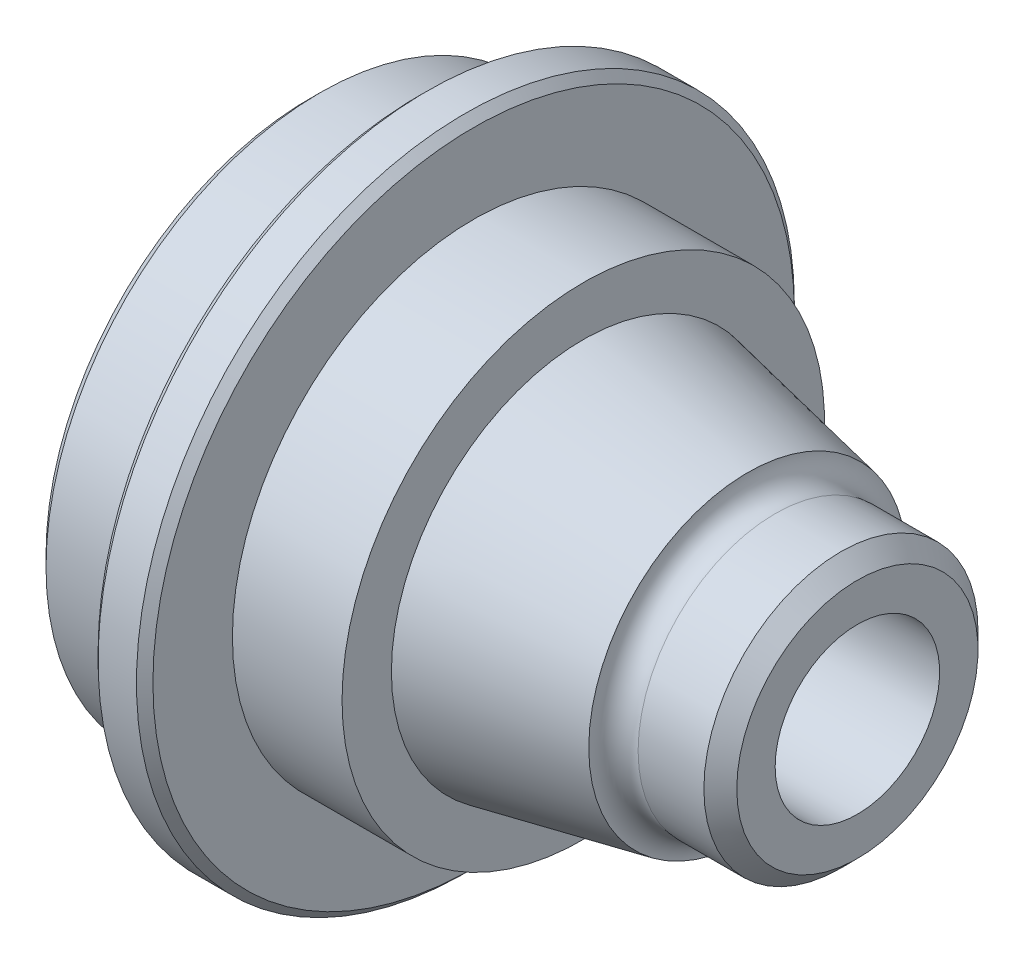
ISO-10303-21;
HEADER;
FILE_DESCRIPTION(('STEP AP214'),'2;1');
FILE_NAME('part.step','',(''),(''),'','','');
FILE_SCHEMA(('AUTOMOTIVE_DESIGN { 1 0 10303 214 1 1 1 1 }'));
ENDSEC;
DATA;
#1=APPLICATION_CONTEXT('core data for automotive mechanical design processes');
#2=APPLICATION_PROTOCOL_DEFINITION('international standard','automotive_design',2000,#1);
#3=PRODUCT_CONTEXT('',#1,'mechanical');
#4=PRODUCT('Part','Part','',(#3));
#5=PRODUCT_RELATED_PRODUCT_CATEGORY('part','',(#4));
#6=PRODUCT_DEFINITION_FORMATION('','',#4);
#7=PRODUCT_DEFINITION_CONTEXT('part definition',#1,'design');
#8=PRODUCT_DEFINITION('design','',#6,#7);
#9=PRODUCT_DEFINITION_SHAPE('','',#8);
#10=(LENGTH_UNIT() NAMED_UNIT(*) SI_UNIT(.MILLI.,.METRE.));
#11=(NAMED_UNIT(*) PLANE_ANGLE_UNIT() SI_UNIT($,.RADIAN.));
#12=(NAMED_UNIT(*) SI_UNIT($,.STERADIAN.) SOLID_ANGLE_UNIT());
#13=UNCERTAINTY_MEASURE_WITH_UNIT(LENGTH_MEASURE(1.E-05),#10,'distance_accuracy_value','');
#14=(GEOMETRIC_REPRESENTATION_CONTEXT(3) GLOBAL_UNCERTAINTY_ASSIGNED_CONTEXT((#13)) GLOBAL_UNIT_ASSIGNED_CONTEXT((#10,
#11,#12)) REPRESENTATION_CONTEXT('',''));
#15=CARTESIAN_POINT('',(0.,0.,0.));
#16=DIRECTION('',(0.,0.,1.));
#17=DIRECTION('',(1.,0.,0.));
#18=AXIS2_PLACEMENT_3D('',#15,#16,#17);
#19=CARTESIAN_POINT('',(-69.26918308439,0.,0.));
#20=DIRECTION('',(-1.,0.,0.));
#21=DIRECTION('',(0.,0.,1.));
#22=AXIS2_PLACEMENT_3D('',#19,#20,#21);
#23=DEGENERATE_TOROIDAL_SURFACE('',#22,25.4998694941201,60.,.F.);
#24=CARTESIAN_POINT('',(-27.2135847593865,0.,0.));
#25=DIRECTION('',(-1.,0.,0.));
#26=DIRECTION('',(0.,0.,1.));
#27=AXIS2_PLACEMENT_3D('',#24,#25,#26);
#28=CIRCLE('',#27,17.2941330006918);
#29=CARTESIAN_POINT('',(-27.2135847593865,0.,17.2941330006918));
#30=VERTEX_POINT('',#29);
#31=EDGE_CURVE('E80',#30,#30,#28,.F.);
#32=ORIENTED_EDGE('',*,*,#31,.T.);
#33=EDGE_LOOP('',(#32));
#34=FACE_BOUND('',#33,.T.);
#35=CARTESIAN_POINT('',(-77.,0.,0.));
#36=DIRECTION('',(-1.,0.,0.));
#37=DIRECTION('',(0.,0.,1.));
#38=AXIS2_PLACEMENT_3D('',#35,#36,#37);
#39=CIRCLE('',#38,34.);
#40=CARTESIAN_POINT('',(-77.,0.,34.));
#41=VERTEX_POINT('',#40);
#42=EDGE_CURVE('E141',#41,#41,#39,.T.);
#43=ORIENTED_EDGE('',*,*,#42,.T.);
#44=EDGE_LOOP('',(#43));
#45=FACE_BOUND('',#44,.T.);
#46=ADVANCED_FACE('F44',(#34,#45),#23,.T.);
#47=CARTESIAN_POINT('',(-117.125626325083,0.,0.));
#48=DIRECTION('',(-1.,0.,0.));
#49=DIRECTION('',(0.,0.,1.));
#50=AXIS2_PLACEMENT_3D('',#47,#48,#49);
#51=CYLINDRICAL_SURFACE('',#50,15.);
#52=CARTESIAN_POINT('',(-21.606171649386,0.,0.));
#53=DIRECTION('',(1.,0.,0.));
#54=DIRECTION('',(0.,0.,-1.));
#55=AXIS2_PLACEMENT_3D('',#52,#53,#54);
#56=CIRCLE('',#55,15.);
#57=CARTESIAN_POINT('',(-21.606171649386,0.,-15.));
#58=VERTEX_POINT('',#57);
#59=EDGE_CURVE('E84',#58,#58,#56,.F.);
#60=ORIENTED_EDGE('',*,*,#59,.T.);
#61=EDGE_LOOP('',(#60));
#62=FACE_BOUND('',#61,.T.);
#63=CARTESIAN_POINT('',(0.,0.,0.));
#64=DIRECTION('',(-1.,0.,0.));
#65=DIRECTION('',(0.,0.,1.));
#66=AXIS2_PLACEMENT_3D('',#63,#64,#65);
#67=CIRCLE('',#66,15.);
#68=CARTESIAN_POINT('',(0.,0.,15.));
#69=VERTEX_POINT('',#68);
#70=EDGE_CURVE('E103',#69,#69,#67,.T.);
#71=ORIENTED_EDGE('',*,*,#70,.F.);
#72=EDGE_LOOP('',(#71));
#73=FACE_BOUND('',#72,.T.);
#74=ADVANCED_FACE('F178',(#62,#73),#51,.F.);
#75=CARTESIAN_POINT('',(0.,0.,0.));
#76=DIRECTION('',(1.,0.,0.));
#77=DIRECTION('',(0.,0.,-1.));
#78=AXIS2_PLACEMENT_3D('',#75,#76,#77);
#79=PLANE('',#78);
#80=CARTESIAN_POINT('',(0.,0.,0.));
#81=DIRECTION('',(1.,0.,0.));
#82=DIRECTION('',(0.,0.,-1.));
#83=AXIS2_PLACEMENT_3D('',#80,#81,#82);
#84=CIRCLE('',#83,22.);
#85=CARTESIAN_POINT('',(0.,0.,22.));
#86=VERTEX_POINT('',#85);
#87=EDGE_CURVE('E10',#86,#86,#84,.T.);
#88=ORIENTED_EDGE('',*,*,#87,.T.);
#89=EDGE_LOOP('',(#88));
#90=FACE_BOUND('',#89,.T.);
#91=ORIENTED_EDGE('',*,*,#70,.T.);
#92=EDGE_LOOP('',(#91));
#93=FACE_BOUND('',#92,.T.);
#94=ADVANCED_FACE('F184',(#90,#93),#79,.T.);
#95=CARTESIAN_POINT('',(-117.125626325083,0.,0.));
#96=DIRECTION('',(-1.,0.,0.));
#97=DIRECTION('',(0.,0.,1.));
#98=AXIS2_PLACEMENT_3D('',#95,#96,#97);
#99=CYLINDRICAL_SURFACE('',#98,25.);
#100=CARTESIAN_POINT('',(-2.99999999999998,0.,0.));
#101=DIRECTION('',(1.,0.,0.));
#102=DIRECTION('',(0.,0.,-1.));
#103=AXIS2_PLACEMENT_3D('',#100,#101,#102);
#104=CIRCLE('',#103,25.);
#105=CARTESIAN_POINT('',(-2.99999999999998,0.,25.));
#106=VERTEX_POINT('',#105);
#107=EDGE_CURVE('E53',#106,#106,#104,.F.);
#108=ORIENTED_EDGE('',*,*,#107,.T.);
#109=EDGE_LOOP('',(#108));
#110=FACE_BOUND('',#109,.T.);
#111=CARTESIAN_POINT('',(-15.,0.,0.));
#112=DIRECTION('',(-1.,0.,0.));
#113=DIRECTION('',(0.,0.,1.));
#114=AXIS2_PLACEMENT_3D('',#111,#112,#113);
#115=CIRCLE('',#114,25.);
#116=CARTESIAN_POINT('',(-15.,0.,25.));
#117=VERTEX_POINT('',#116);
#118=EDGE_CURVE('E107',#117,#117,#115,.T.);
#119=ORIENTED_EDGE('',*,*,#118,.F.);
#120=EDGE_LOOP('',(#119));
#121=FACE_BOUND('',#120,.T.);
#122=ADVANCED_FACE('F261',(#110,#121),#99,.T.);
#123=CARTESIAN_POINT('',(-16.0020338992406,0.,0.));
#124=DIRECTION('',(-1.,0.,0.));
#125=DIRECTION('',(0.,0.,1.));
#126=AXIS2_PLACEMENT_3D('',#123,#124,#125);
#127=TOROIDAL_SURFACE('',#126,28.8724576259493,4.);
#128=ORIENTED_EDGE('',*,*,#118,.T.);
#129=EDGE_LOOP('',(#128));
#130=FACE_BOUND('',#129,.T.);
#131=CARTESIAN_POINT('',(-20.,0.,0.));
#132=DIRECTION('',(-1.,0.,0.));
#133=DIRECTION('',(0.,0.,1.));
#134=AXIS2_PLACEMENT_3D('',#131,#132,#133);
#135=CIRCLE('',#134,29.);
#136=CARTESIAN_POINT('',(-20.,0.,29.));
#137=VERTEX_POINT('',#136);
#138=EDGE_CURVE('E111',#137,#137,#135,.T.);
#139=ORIENTED_EDGE('',*,*,#138,.F.);
#140=EDGE_LOOP('',(#139));
#141=FACE_BOUND('',#140,.T.);
#142=ADVANCED_FACE('F257',(#130,#141),#127,.F.);
#143=CARTESIAN_POINT('',(-50.,0.,0.));
#144=DIRECTION('',(-1.,0.,0.));
#145=DIRECTION('',(0.,0.,1.));
#146=AXIS2_PLACEMENT_3D('',#143,#144,#145);
#147=CONICAL_SURFACE('',#146,35.,0.197395559849881);
#148=ORIENTED_EDGE('',*,*,#138,.T.);
#149=EDGE_LOOP('',(#148));
#150=FACE_BOUND('',#149,.T.);
#151=CARTESIAN_POINT('',(-50.,0.,0.));
#152=DIRECTION('',(-1.,0.,0.));
#153=DIRECTION('',(0.,0.,1.));
#154=AXIS2_PLACEMENT_3D('',#151,#152,#153);
#155=CIRCLE('',#154,35.);
#156=CARTESIAN_POINT('',(-50.,0.,35.));
#157=VERTEX_POINT('',#156);
#158=EDGE_CURVE('E115',#157,#157,#155,.T.);
#159=ORIENTED_EDGE('',*,*,#158,.F.);
#160=EDGE_LOOP('',(#159));
#161=FACE_BOUND('',#160,.T.);
#162=ADVANCED_FACE('F253',(#150,#161),#147,.T.);
#163=CARTESIAN_POINT('',(-50.,0.,0.));
#164=DIRECTION('',(1.,0.,0.));
#165=DIRECTION('',(0.,0.,-1.));
#166=AXIS2_PLACEMENT_3D('',#163,#164,#165);
#167=PLANE('',#166);
#168=ORIENTED_EDGE('',*,*,#158,.T.);
#169=EDGE_LOOP('',(#168));
#170=FACE_BOUND('',#169,.T.);
#171=CARTESIAN_POINT('',(-50.,0.,0.));
#172=DIRECTION('',(-1.,0.,0.));
#173=DIRECTION('',(0.,0.,1.));
#174=AXIS2_PLACEMENT_3D('',#171,#172,#173);
#175=CIRCLE('',#174,44.);
#176=CARTESIAN_POINT('',(-50.,0.,44.));
#177=VERTEX_POINT('',#176);
#178=EDGE_CURVE('E118',#177,#177,#175,.T.);
#179=ORIENTED_EDGE('',*,*,#178,.F.);
#180=EDGE_LOOP('',(#179));
#181=FACE_BOUND('',#180,.T.);
#182=ADVANCED_FACE('F249',(#170,#181),#167,.T.);
#183=CARTESIAN_POINT('',(-117.125626325083,0.,0.));
#184=DIRECTION('',(-1.,0.,0.));
#185=DIRECTION('',(0.,0.,1.));
#186=AXIS2_PLACEMENT_3D('',#183,#184,#185);
#187=CYLINDRICAL_SURFACE('',#186,44.);
#188=ORIENTED_EDGE('',*,*,#178,.T.);
#189=EDGE_LOOP('',(#188));
#190=FACE_BOUND('',#189,.T.);
#191=CARTESIAN_POINT('',(-70.,0.,0.));
#192=DIRECTION('',(-1.,0.,0.));
#193=DIRECTION('',(0.,0.,1.));
#194=AXIS2_PLACEMENT_3D('',#191,#192,#193);
#195=CIRCLE('',#194,44.);
#196=CARTESIAN_POINT('',(-70.,0.,44.));
#197=VERTEX_POINT('',#196);
#198=EDGE_CURVE('E121',#197,#197,#195,.T.);
#199=ORIENTED_EDGE('',*,*,#198,.F.);
#200=EDGE_LOOP('',(#199));
#201=FACE_BOUND('',#200,.T.);
#202=ADVANCED_FACE('F245',(#190,#201),#187,.T.);
#203=CARTESIAN_POINT('',(-70.,0.,0.));
#204=DIRECTION('',(1.,0.,0.));
#205=DIRECTION('',(0.,0.,-1.));
#206=AXIS2_PLACEMENT_3D('',#203,#204,#205);
#207=PLANE('',#206);
#208=CARTESIAN_POINT('',(-70.,0.,0.));
#209=DIRECTION('',(1.,0.,0.));
#210=DIRECTION('',(0.,0.,-1.));
#211=AXIS2_PLACEMENT_3D('',#208,#209,#210);
#212=CIRCLE('',#211,58.5);
#213=CARTESIAN_POINT('',(-70.,0.,-58.5));
#214=VERTEX_POINT('',#213);
#215=EDGE_CURVE('E66',#214,#214,#212,.T.);
#216=ORIENTED_EDGE('',*,*,#215,.T.);
#217=EDGE_LOOP('',(#216));
#218=FACE_BOUND('',#217,.T.);
#219=ORIENTED_EDGE('',*,*,#198,.T.);
#220=EDGE_LOOP('',(#219));
#221=FACE_BOUND('',#220,.T.);
#222=ADVANCED_FACE('F241',(#218,#221),#207,.T.);
#223=CARTESIAN_POINT('',(-117.125626325083,0.,0.));
#224=DIRECTION('',(-1.,0.,0.));
#225=DIRECTION('',(0.,0.,1.));
#226=AXIS2_PLACEMENT_3D('',#223,#224,#225);
#227=CYLINDRICAL_SURFACE('',#226,60.);
#228=CARTESIAN_POINT('',(-71.5,0.,0.));
#229=DIRECTION('',(1.,0.,0.));
#230=DIRECTION('',(0.,0.,-1.));
#231=AXIS2_PLACEMENT_3D('',#228,#229,#230);
#232=CIRCLE('',#231,60.);
#233=CARTESIAN_POINT('',(-71.5,0.,-60.));
#234=VERTEX_POINT('',#233);
#235=EDGE_CURVE('E72',#234,#234,#232,.F.);
#236=ORIENTED_EDGE('',*,*,#235,.T.);
#237=EDGE_LOOP('',(#236));
#238=FACE_BOUND('',#237,.T.);
#239=CARTESIAN_POINT('',(-78.5,0.,0.));
#240=DIRECTION('',(-1.,0.,0.));
#241=DIRECTION('',(0.,0.,1.));
#242=AXIS2_PLACEMENT_3D('',#239,#240,#241);
#243=CIRCLE('',#242,60.);
#244=CARTESIAN_POINT('',(-78.4999999999999,0.,-60.));
#245=VERTEX_POINT('',#244);
#246=EDGE_CURVE('E76',#245,#245,#243,.F.);
#247=ORIENTED_EDGE('',*,*,#246,.T.);
#248=EDGE_LOOP('',(#247));
#249=FACE_BOUND('',#248,.T.);
#250=ADVANCED_FACE('F229',(#238,#249),#227,.T.);
#251=CARTESIAN_POINT('',(-80.,0.,0.));
#252=DIRECTION('',(-1.,0.,0.));
#253=DIRECTION('',(0.,0.,1.));
#254=AXIS2_PLACEMENT_3D('',#251,#252,#253);
#255=PLANE('',#254);
#256=CARTESIAN_POINT('',(-80.,0.,0.));
#257=DIRECTION('',(-1.,0.,0.));
#258=DIRECTION('',(0.,0.,1.));
#259=AXIS2_PLACEMENT_3D('',#256,#257,#258);
#260=CIRCLE('',#259,58.5);
#261=CARTESIAN_POINT('',(-80.,0.,-58.5));
#262=VERTEX_POINT('',#261);
#263=EDGE_CURVE('E60',#262,#262,#260,.T.);
#264=ORIENTED_EDGE('',*,*,#263,.T.);
#265=EDGE_LOOP('',(#264));
#266=FACE_BOUND('',#265,.T.);
#267=CARTESIAN_POINT('',(-80.,0.,0.));
#268=DIRECTION('',(-1.,0.,0.));
#269=DIRECTION('',(0.,0.,1.));
#270=AXIS2_PLACEMENT_3D('',#267,#268,#269);
#271=CIRCLE('',#270,50.);
#272=CARTESIAN_POINT('',(-80.,0.,50.));
#273=VERTEX_POINT('',#272);
#274=EDGE_CURVE('E125',#273,#273,#271,.T.);
#275=ORIENTED_EDGE('',*,*,#274,.F.);
#276=EDGE_LOOP('',(#275));
#277=FACE_BOUND('',#276,.T.);
#278=ADVANCED_FACE('F226',(#266,#277),#255,.T.);
#279=CARTESIAN_POINT('',(-117.125626325083,0.,0.));
#280=DIRECTION('',(-1.,0.,0.));
#281=DIRECTION('',(0.,0.,1.));
#282=AXIS2_PLACEMENT_3D('',#279,#280,#281);
#283=CYLINDRICAL_SURFACE('',#282,50.);
#284=CARTESIAN_POINT('',(-97.9999999999999,0.,0.));
#285=DIRECTION('',(-1.,0.,0.));
#286=DIRECTION('',(0.,0.,1.));
#287=AXIS2_PLACEMENT_3D('',#284,#285,#286);
#288=CIRCLE('',#287,50.);
#289=CARTESIAN_POINT('',(-97.9999999999999,0.,50.));
#290=VERTEX_POINT('',#289);
#291=EDGE_CURVE('E88',#290,#290,#288,.F.);
#292=ORIENTED_EDGE('',*,*,#291,.T.);
#293=EDGE_LOOP('',(#292));
#294=FACE_BOUND('',#293,.T.);
#295=ORIENTED_EDGE('',*,*,#274,.T.);
#296=EDGE_LOOP('',(#295));
#297=FACE_BOUND('',#296,.T.);
#298=ADVANCED_FACE('F174',(#294,#297),#283,.T.);
#299=CARTESIAN_POINT('',(-100.,0.,0.));
#300=DIRECTION('',(-1.,0.,0.));
#301=DIRECTION('',(0.,0.,1.));
#302=AXIS2_PLACEMENT_3D('',#299,#300,#301);
#303=PLANE('',#302);
#304=CARTESIAN_POINT('',(-100.,0.,0.));
#305=DIRECTION('',(-1.,0.,0.));
#306=DIRECTION('',(0.,0.,1.));
#307=AXIS2_PLACEMENT_3D('',#304,#305,#306);
#308=CIRCLE('',#307,42.);
#309=CARTESIAN_POINT('',(-100.,0.,42.));
#310=VERTEX_POINT('',#309);
#311=EDGE_CURVE('E91',#310,#310,#308,.F.);
#312=ORIENTED_EDGE('',*,*,#311,.T.);
#313=EDGE_LOOP('',(#312));
#314=FACE_BOUND('',#313,.T.);
#315=CARTESIAN_POINT('',(-100.,0.,0.));
#316=DIRECTION('',(-1.,0.,0.));
#317=DIRECTION('',(0.,0.,1.));
#318=AXIS2_PLACEMENT_3D('',#315,#316,#317);
#319=CIRCLE('',#318,48.);
#320=CARTESIAN_POINT('',(-100.,0.,48.));
#321=VERTEX_POINT('',#320);
#322=EDGE_CURVE('E95',#321,#321,#319,.T.);
#323=ORIENTED_EDGE('',*,*,#322,.T.);
#324=EDGE_LOOP('',(#323));
#325=FACE_BOUND('',#324,.T.);
#326=ADVANCED_FACE('F168',(#314,#325),#303,.T.);
#327=CARTESIAN_POINT('',(-117.125626325083,0.,0.));
#328=DIRECTION('',(-1.,0.,0.));
#329=DIRECTION('',(0.,0.,1.));
#330=AXIS2_PLACEMENT_3D('',#327,#328,#329);
#331=CYLINDRICAL_SURFACE('',#330,40.);
#332=CARTESIAN_POINT('',(-98.,0.,0.));
#333=DIRECTION('',(-1.,0.,0.));
#334=DIRECTION('',(0.,0.,1.));
#335=AXIS2_PLACEMENT_3D('',#332,#333,#334);
#336=CIRCLE('',#335,40.);
#337=CARTESIAN_POINT('',(-98.,0.,40.));
#338=VERTEX_POINT('',#337);
#339=EDGE_CURVE('E99',#338,#338,#336,.T.);
#340=ORIENTED_EDGE('',*,*,#339,.T.);
#341=EDGE_LOOP('',(#340));
#342=FACE_BOUND('',#341,.T.);
#343=CARTESIAN_POINT('',(-79.,0.,0.));
#344=DIRECTION('',(-1.,0.,0.));
#345=DIRECTION('',(0.,0.,1.));
#346=AXIS2_PLACEMENT_3D('',#343,#344,#345);
#347=CIRCLE('',#346,40.);
#348=CARTESIAN_POINT('',(-79.,0.,40.));
#349=VERTEX_POINT('',#348);
#350=EDGE_CURVE('E129',#349,#349,#347,.T.);
#351=ORIENTED_EDGE('',*,*,#350,.F.);
#352=EDGE_LOOP('',(#351));
#353=FACE_BOUND('',#352,.T.);
#354=ADVANCED_FACE('F163',(#342,#353),#331,.F.);
#355=CARTESIAN_POINT('',(-79.,0.,0.));
#356=DIRECTION('',(-1.,0.,0.));
#357=DIRECTION('',(0.,0.,1.));
#358=AXIS2_PLACEMENT_3D('',#355,#356,#357);
#359=PLANE('',#358);
#360=CARTESIAN_POINT('',(-79.,0.,0.));
#361=DIRECTION('',(-1.,0.,0.));
#362=DIRECTION('',(0.,0.,1.));
#363=AXIS2_PLACEMENT_3D('',#360,#361,#362);
#364=CIRCLE('',#363,42.);
#365=CARTESIAN_POINT('',(-79.,0.,42.));
#366=VERTEX_POINT('',#365);
#367=EDGE_CURVE('E133',#366,#366,#364,.T.);
#368=ORIENTED_EDGE('',*,*,#367,.F.);
#369=EDGE_LOOP('',(#368));
#370=FACE_BOUND('',#369,.T.);
#371=ORIENTED_EDGE('',*,*,#350,.T.);
#372=EDGE_LOOP('',(#371));
#373=FACE_BOUND('',#372,.T.);
#374=ADVANCED_FACE('F157',(#370,#373),#359,.F.);
#375=CARTESIAN_POINT('',(-117.125626325083,0.,0.));
#376=DIRECTION('',(-1.,0.,0.));
#377=DIRECTION('',(0.,0.,1.));
#378=AXIS2_PLACEMENT_3D('',#375,#376,#377);
#379=CYLINDRICAL_SURFACE('',#378,42.);
#380=CARTESIAN_POINT('',(-77.,0.,0.));
#381=DIRECTION('',(-1.,0.,0.));
#382=DIRECTION('',(0.,0.,1.));
#383=AXIS2_PLACEMENT_3D('',#380,#381,#382);
#384=CIRCLE('',#383,42.);
#385=CARTESIAN_POINT('',(-77.,0.,42.));
#386=VERTEX_POINT('',#385);
#387=EDGE_CURVE('E137',#386,#386,#384,.T.);
#388=ORIENTED_EDGE('',*,*,#387,.F.);
#389=EDGE_LOOP('',(#388));
#390=FACE_BOUND('',#389,.T.);
#391=ORIENTED_EDGE('',*,*,#367,.T.);
#392=EDGE_LOOP('',(#391));
#393=FACE_BOUND('',#392,.T.);
#394=ADVANCED_FACE('F151',(#390,#393),#379,.F.);
#395=CARTESIAN_POINT('',(-77.,0.,0.));
#396=DIRECTION('',(1.,0.,0.));
#397=DIRECTION('',(0.,0.,-1.));
#398=AXIS2_PLACEMENT_3D('',#395,#396,#397);
#399=PLANE('',#398);
#400=ORIENTED_EDGE('',*,*,#42,.F.);
#401=EDGE_LOOP('',(#400));
#402=FACE_BOUND('',#401,.T.);
#403=ORIENTED_EDGE('',*,*,#387,.T.);
#404=EDGE_LOOP('',(#403));
#405=FACE_BOUND('',#404,.T.);
#406=ADVANCED_FACE('F147',(#402,#405),#399,.F.);
#407=CARTESIAN_POINT('',(-98.,0.,0.));
#408=DIRECTION('',(-1.,0.,0.));
#409=DIRECTION('',(0.,0.,1.));
#410=AXIS2_PLACEMENT_3D('',#407,#408,#409);
#411=CONICAL_SURFACE('',#410,40.,0.785398163397457);
#412=ORIENTED_EDGE('',*,*,#311,.F.);
#413=EDGE_LOOP('',(#412));
#414=FACE_BOUND('',#413,.T.);
#415=ORIENTED_EDGE('',*,*,#339,.F.);
#416=EDGE_LOOP('',(#415));
#417=FACE_BOUND('',#416,.T.);
#418=ADVANCED_FACE('F150',(#414,#417),#411,.F.);
#419=CARTESIAN_POINT('',(-100.,0.,0.));
#420=DIRECTION('',(1.,0.,0.));
#421=DIRECTION('',(0.,0.,-1.));
#422=AXIS2_PLACEMENT_3D('',#419,#420,#421);
#423=CONICAL_SURFACE('',#422,48.,0.785398163397438);
#424=ORIENTED_EDGE('',*,*,#291,.F.);
#425=EDGE_LOOP('',(#424));
#426=FACE_BOUND('',#425,.T.);
#427=ORIENTED_EDGE('',*,*,#322,.F.);
#428=EDGE_LOOP('',(#427));
#429=FACE_BOUND('',#428,.T.);
#430=ADVANCED_FACE('F195',(#426,#429),#423,.T.);
#431=CARTESIAN_POINT('',(-21.606171649386,0.,0.));
#432=DIRECTION('',(1.,0.,0.));
#433=DIRECTION('',(0.,0.,-1.));
#434=AXIS2_PLACEMENT_3D('',#431,#432,#433);
#435=TOROIDAL_SURFACE('',#434,23.,8.);
#436=ORIENTED_EDGE('',*,*,#31,.F.);
#437=EDGE_LOOP('',(#436));
#438=FACE_BOUND('',#437,.T.);
#439=ORIENTED_EDGE('',*,*,#59,.F.);
#440=EDGE_LOOP('',(#439));
#441=FACE_BOUND('',#440,.T.);
#442=ADVANCED_FACE('F202',(#438,#441),#435,.T.);
#443=CARTESIAN_POINT('',(-71.5,0.,0.));
#444=DIRECTION('',(-1.,0.,0.));
#445=DIRECTION('',(0.,0.,1.));
#446=AXIS2_PLACEMENT_3D('',#443,#444,#445);
#447=CONICAL_SURFACE('',#446,60.,0.785398163397444);
#448=ORIENTED_EDGE('',*,*,#215,.F.);
#449=EDGE_LOOP('',(#448));
#450=FACE_BOUND('',#449,.T.);
#451=ORIENTED_EDGE('',*,*,#235,.F.);
#452=EDGE_LOOP('',(#451));
#453=FACE_BOUND('',#452,.T.);
#454=ADVANCED_FACE('F206',(#450,#453),#447,.T.);
#455=CARTESIAN_POINT('',(-80.,0.,0.));
#456=DIRECTION('',(1.,0.,0.));
#457=DIRECTION('',(0.,0.,-1.));
#458=AXIS2_PLACEMENT_3D('',#455,#456,#457);
#459=CONICAL_SURFACE('',#458,58.5,0.785398163397439);
#460=CARTESIAN_POINT('',(-78.4999999999999,0.,-60.));
#461=CARTESIAN_POINT('',(-78.5156249999999,0.,-59.984375));
#462=CARTESIAN_POINT('',(-78.5312499999999,0.,-59.96875));
#463=CARTESIAN_POINT('',(-78.5625,0.,-59.9375));
#464=CARTESIAN_POINT('',(-78.5781249999999,0.,-59.921875));
#465=CARTESIAN_POINT('',(-78.609375,0.,-59.890625));
#466=CARTESIAN_POINT('',(-78.6249999999999,0.,-59.875));
#467=CARTESIAN_POINT('',(-78.65625,0.,-59.84375));
#468=CARTESIAN_POINT('',(-78.6718749999999,0.,-59.828125));
#469=CARTESIAN_POINT('',(-78.703125,0.,-59.796875));
#470=CARTESIAN_POINT('',(-78.7187499999999,0.,-59.78125));
#471=CARTESIAN_POINT('',(-78.75,0.,-59.75));
#472=CARTESIAN_POINT('',(-78.7656249999999,0.,-59.734375));
#473=CARTESIAN_POINT('',(-78.796875,0.,-59.703125));
#474=CARTESIAN_POINT('',(-78.8125,0.,-59.6875));
#475=CARTESIAN_POINT('',(-78.84375,0.,-59.65625));
#476=CARTESIAN_POINT('',(-78.859375,0.,-59.640625));
#477=CARTESIAN_POINT('',(-78.890625,0.,-59.609375));
#478=CARTESIAN_POINT('',(-78.90625,0.,-59.59375));
#479=CARTESIAN_POINT('',(-78.9375,0.,-59.5625));
#480=CARTESIAN_POINT('',(-78.953125,0.,-59.546875));
#481=CARTESIAN_POINT('',(-78.984375,0.,-59.515625));
#482=CARTESIAN_POINT('',(-79.,0.,-59.5));
#483=CARTESIAN_POINT('',(-79.03125,0.,-59.46875));
#484=CARTESIAN_POINT('',(-79.046875,0.,-59.453125));
#485=CARTESIAN_POINT('',(-79.078125,0.,-59.421875));
#486=CARTESIAN_POINT('',(-79.09375,0.,-59.40625));
#487=CARTESIAN_POINT('',(-79.125,0.,-59.375));
#488=CARTESIAN_POINT('',(-79.140625,0.,-59.359375));
#489=CARTESIAN_POINT('',(-79.171875,0.,-59.328125));
#490=CARTESIAN_POINT('',(-79.1875,0.,-59.3125));
#491=CARTESIAN_POINT('',(-79.21875,0.,-59.28125));
#492=CARTESIAN_POINT('',(-79.234375,0.,-59.265625));
#493=CARTESIAN_POINT('',(-79.265625,0.,-59.234375));
#494=CARTESIAN_POINT('',(-79.28125,0.,-59.21875));
#495=CARTESIAN_POINT('',(-79.3125,0.,-59.1875));
#496=CARTESIAN_POINT('',(-79.328125,0.,-59.171875));
#497=CARTESIAN_POINT('',(-79.359375,0.,-59.140625));
#498=CARTESIAN_POINT('',(-79.375,0.,-59.125));
#499=CARTESIAN_POINT('',(-79.40625,0.,-59.09375));
#500=CARTESIAN_POINT('',(-79.421875,0.,-59.078125));
#501=CARTESIAN_POINT('',(-79.453125,0.,-59.046875));
#502=CARTESIAN_POINT('',(-79.46875,0.,-59.03125));
#503=CARTESIAN_POINT('',(-79.5,0.,-59.));
#504=CARTESIAN_POINT('',(-79.515625,0.,-58.984375));
#505=CARTESIAN_POINT('',(-79.546875,0.,-58.953125));
#506=CARTESIAN_POINT('',(-79.5625,0.,-58.9375));
#507=CARTESIAN_POINT('',(-79.59375,0.,-58.90625));
#508=CARTESIAN_POINT('',(-79.609375,0.,-58.890625));
#509=CARTESIAN_POINT('',(-79.640625,0.,-58.859375));
#510=CARTESIAN_POINT('',(-79.65625,0.,-58.84375));
#511=CARTESIAN_POINT('',(-79.6875,0.,-58.8125));
#512=CARTESIAN_POINT('',(-79.703125,0.,-58.796875));
#513=CARTESIAN_POINT('',(-79.734375,0.,-58.765625));
#514=CARTESIAN_POINT('',(-79.75,0.,-58.75));
#515=CARTESIAN_POINT('',(-79.78125,0.,-58.71875));
#516=CARTESIAN_POINT('',(-79.796875,0.,-58.703125));
#517=CARTESIAN_POINT('',(-79.828125,0.,-58.671875));
#518=CARTESIAN_POINT('',(-79.84375,0.,-58.65625));
#519=CARTESIAN_POINT('',(-79.875,0.,-58.625));
#520=CARTESIAN_POINT('',(-79.890625,0.,-58.609375));
#521=CARTESIAN_POINT('',(-79.921875,0.,-58.578125));
#522=CARTESIAN_POINT('',(-79.9375,0.,-58.5625));
#523=CARTESIAN_POINT('',(-79.96875,0.,-58.53125));
#524=CARTESIAN_POINT('',(-79.984375,0.,-58.515625));
#525=CARTESIAN_POINT('',(-80.,0.,-58.5));
#526=B_SPLINE_CURVE_WITH_KNOTS('',3,(#460,#461,#462,#463,#464,#465,#466,#467,#468,#469,#470,
#471,#472,#473,#474,#475,#476,#477,#478,#479,#480,#481,#482,#483,#484,#485,#486,#487,#488,#489,
#490,#491,#492,#493,#494,#495,#496,#497,#498,#499,#500,#501,#502,#503,#504,#505,#506,#507,#508,
#509,#510,#511,#512,#513,#514,#515,#516,#517,#518,#519,#520,#521,#522,#523,#524,#525),
.UNSPECIFIED.,.F.,.F.,(4,2,2,2,2,2,2,2,2,2,2,2,2,2,2,2,2,2,2,2,2,2,2,2,2,2,2,2,2,2,2,2,4),(0.,
0.0662912607362414,0.132582521472483,0.198873782208719,0.265165042944961,0.331456303681202,
0.397747564417443,0.464038825153685,0.530330085889921,0.596621346626162,0.662912607362404,
0.729203868098645,0.795495128834886,0.861786389571128,0.928077650307364,0.994368911043605,
1.06066017177985,1.12695143251609,1.19324269325233,1.25953395398857,1.32582521472481,
1.39211647546105,1.45840773619729,1.52469899693353,1.59099025766977,1.65728151840601,
1.72357277914225,1.78986403987849,1.85615530061473,1.92244656135098,1.98873782208721,
2.05502908282345,2.12132034355969),.UNSPECIFIED.);
#527=EDGE_CURVE('BSEAM212',#245,#262,#526,.T.);
#528=ORIENTED_EDGE('',*,*,#246,.F.);
#529=ORIENTED_EDGE('',*,*,#263,.F.);
#530=ORIENTED_EDGE('',*,*,#527,.T.);
#531=ORIENTED_EDGE('',*,*,#527,.F.);
#532=EDGE_LOOP('',(#528,#530,#529,#531));
#533=FACE_BOUND('',#532,.T.);
#534=ADVANCED_FACE('F212',(#533),#459,.T.);
#535=CARTESIAN_POINT('',(-2.99999999999998,0.,0.));
#536=DIRECTION('',(-1.,0.,0.));
#537=DIRECTION('',(0.,0.,1.));
#538=AXIS2_PLACEMENT_3D('',#535,#536,#537);
#539=CONICAL_SURFACE('',#538,25.,0.785398163397447);
#540=CARTESIAN_POINT('',(0.,0.,22.));
#541=CARTESIAN_POINT('',(-0.0312499999999997,0.,22.03125));
#542=CARTESIAN_POINT('',(-0.0624999999999994,0.,22.0625));
#543=CARTESIAN_POINT('',(-0.124999999999999,0.,22.125));
#544=CARTESIAN_POINT('',(-0.156249999999998,0.,22.15625));
#545=CARTESIAN_POINT('',(-0.218749999999998,0.,22.21875));
#546=CARTESIAN_POINT('',(-0.249999999999997,0.,22.25));
#547=CARTESIAN_POINT('',(-0.312499999999997,0.,22.3125));
#548=CARTESIAN_POINT('',(-0.343749999999997,0.,22.34375));
#549=CARTESIAN_POINT('',(-0.406249999999997,0.,22.40625));
#550=CARTESIAN_POINT('',(-0.437499999999996,0.,22.4375));
#551=CARTESIAN_POINT('',(-0.499999999999995,0.,22.5));
#552=CARTESIAN_POINT('',(-0.531249999999995,0.,22.53125));
#553=CARTESIAN_POINT('',(-0.593749999999995,0.,22.59375));
#554=CARTESIAN_POINT('',(-0.624999999999994,0.,22.625));
#555=CARTESIAN_POINT('',(-0.687499999999994,0.,22.6875));
#556=CARTESIAN_POINT('',(-0.718749999999994,0.,22.71875));
#557=CARTESIAN_POINT('',(-0.781249999999994,0.,22.78125));
#558=CARTESIAN_POINT('',(-0.812499999999993,0.,22.8125));
#559=CARTESIAN_POINT('',(-0.874999999999993,0.,22.875));
#560=CARTESIAN_POINT('',(-0.906249999999992,0.,22.90625));
#561=CARTESIAN_POINT('',(-0.968749999999992,0.,22.96875));
#562=CARTESIAN_POINT('',(-0.999999999999991,0.,23.));
#563=CARTESIAN_POINT('',(-1.06249999999999,0.,23.0625));
#564=CARTESIAN_POINT('',(-1.09374999999999,0.,23.09375));
#565=CARTESIAN_POINT('',(-1.15624999999999,0.,23.15625));
#566=CARTESIAN_POINT('',(-1.18749999999999,0.,23.1875));
#567=CARTESIAN_POINT('',(-1.24999999999999,0.,23.25));
#568=CARTESIAN_POINT('',(-1.28124999999999,0.,23.28125));
#569=CARTESIAN_POINT('',(-1.34374999999999,0.,23.34375));
#570=CARTESIAN_POINT('',(-1.37499999999999,0.,23.375));
#571=CARTESIAN_POINT('',(-1.43749999999999,0.,23.4375));
#572=CARTESIAN_POINT('',(-1.46874999999999,0.,23.46875));
#573=CARTESIAN_POINT('',(-1.53124999999999,0.,23.53125));
#574=CARTESIAN_POINT('',(-1.56249999999999,0.,23.5625));
#575=CARTESIAN_POINT('',(-1.62499999999999,0.,23.625));
#576=CARTESIAN_POINT('',(-1.65624999999999,0.,23.65625));
#577=CARTESIAN_POINT('',(-1.71874999999999,0.,23.71875));
#578=CARTESIAN_POINT('',(-1.74999999999999,0.,23.75));
#579=CARTESIAN_POINT('',(-1.81249999999998,0.,23.8125));
#580=CARTESIAN_POINT('',(-1.84374999999998,0.,23.84375));
#581=CARTESIAN_POINT('',(-1.90624999999998,0.,23.90625));
#582=CARTESIAN_POINT('',(-1.93749999999998,0.,23.9375));
#583=CARTESIAN_POINT('',(-1.99999999999998,0.,24.));
#584=CARTESIAN_POINT('',(-2.03124999999998,0.,24.03125));
#585=CARTESIAN_POINT('',(-2.09374999999998,0.,24.09375));
#586=CARTESIAN_POINT('',(-2.12499999999998,0.,24.125));
#587=CARTESIAN_POINT('',(-2.18749999999998,0.,24.1875));
#588=CARTESIAN_POINT('',(-2.21874999999998,0.,24.21875));
#589=CARTESIAN_POINT('',(-2.28124999999998,0.,24.28125));
#590=CARTESIAN_POINT('',(-2.31249999999998,0.,24.3125));
#591=CARTESIAN_POINT('',(-2.37499999999998,0.,24.375));
#592=CARTESIAN_POINT('',(-2.40624999999998,0.,24.40625));
#593=CARTESIAN_POINT('',(-2.46874999999998,0.,24.46875));
#594=CARTESIAN_POINT('',(-2.49999999999998,0.,24.5));
#595=CARTESIAN_POINT('',(-2.56249999999998,0.,24.5625));
#596=CARTESIAN_POINT('',(-2.59374999999998,0.,24.59375));
#597=CARTESIAN_POINT('',(-2.65624999999998,0.,24.65625));
#598=CARTESIAN_POINT('',(-2.68749999999998,0.,24.6875));
#599=CARTESIAN_POINT('',(-2.74999999999998,0.,24.75));
#600=CARTESIAN_POINT('',(-2.78124999999998,0.,24.78125));
#601=CARTESIAN_POINT('',(-2.84374999999998,0.,24.84375));
#602=CARTESIAN_POINT('',(-2.87499999999998,0.,24.875));
#603=CARTESIAN_POINT('',(-2.93749999999998,0.,24.9375));
#604=CARTESIAN_POINT('',(-2.96874999999998,0.,24.96875));
#605=CARTESIAN_POINT('',(-2.99999999999998,0.,25.));
#606=B_SPLINE_CURVE_WITH_KNOTS('',3,(#540,#541,#542,#543,#544,#545,#546,#547,#548,#549,#550,
#551,#552,#553,#554,#555,#556,#557,#558,#559,#560,#561,#562,#563,#564,#565,#566,#567,#568,#569,
#570,#571,#572,#573,#574,#575,#576,#577,#578,#579,#580,#581,#582,#583,#584,#585,#586,#587,#588,
#589,#590,#591,#592,#593,#594,#595,#596,#597,#598,#599,#600,#601,#602,#603,#604,#605),
.UNSPECIFIED.,.F.,.F.,(4,2,2,2,2,2,2,2,2,2,2,2,2,2,2,2,2,2,2,2,2,2,2,2,2,2,2,2,2,2,2,2,4),(0.,
0.132582521472475,0.265165042944952,0.397747564417429,0.530330085889904,0.662912607362381,
0.795495128834858,0.928077650307336,1.06066017177981,1.19324269325229,1.32582521472476,
1.45840773619724,1.59099025766972,1.72357277914219,1.85615530061467,1.98873782208715,
2.12132034355962,2.2539028650321,2.38648538650457,2.51906790797705,2.65165042944953,
2.784232950922,2.91681547239448,3.04939799386696,3.18198051533943,3.31456303681191,
3.44714555828439,3.57972807975686,3.71231060122934,3.84489312270182,3.97747564417429,
4.11005816564677,4.24264068711924),.UNSPECIFIED.);
#607=EDGE_CURVE('BSEAM47',#86,#106,#606,.T.);
#608=ORIENTED_EDGE('',*,*,#87,.F.);
#609=ORIENTED_EDGE('',*,*,#107,.F.);
#610=ORIENTED_EDGE('',*,*,#607,.T.);
#611=ORIENTED_EDGE('',*,*,#607,.F.);
#612=EDGE_LOOP('',(#608,#610,#609,#611));
#613=FACE_BOUND('',#612,.T.);
#614=ADVANCED_FACE('F47',(#613),#539,.T.);
#615=CLOSED_SHELL('',(#46,#74,#94,#122,#142,#162,#182,#202,#222,#250,#278,#298,#326,#354,#374,
#394,#406,#418,#430,#442,#454,#534,#614));
#616=MANIFOLD_SOLID_BREP('B2',#615);
#617=ADVANCED_BREP_SHAPE_REPRESENTATION('',(#18,#616),#14);
#618=SHAPE_DEFINITION_REPRESENTATION(#9,#617);
ENDSEC;
END-ISO-10303-21;
